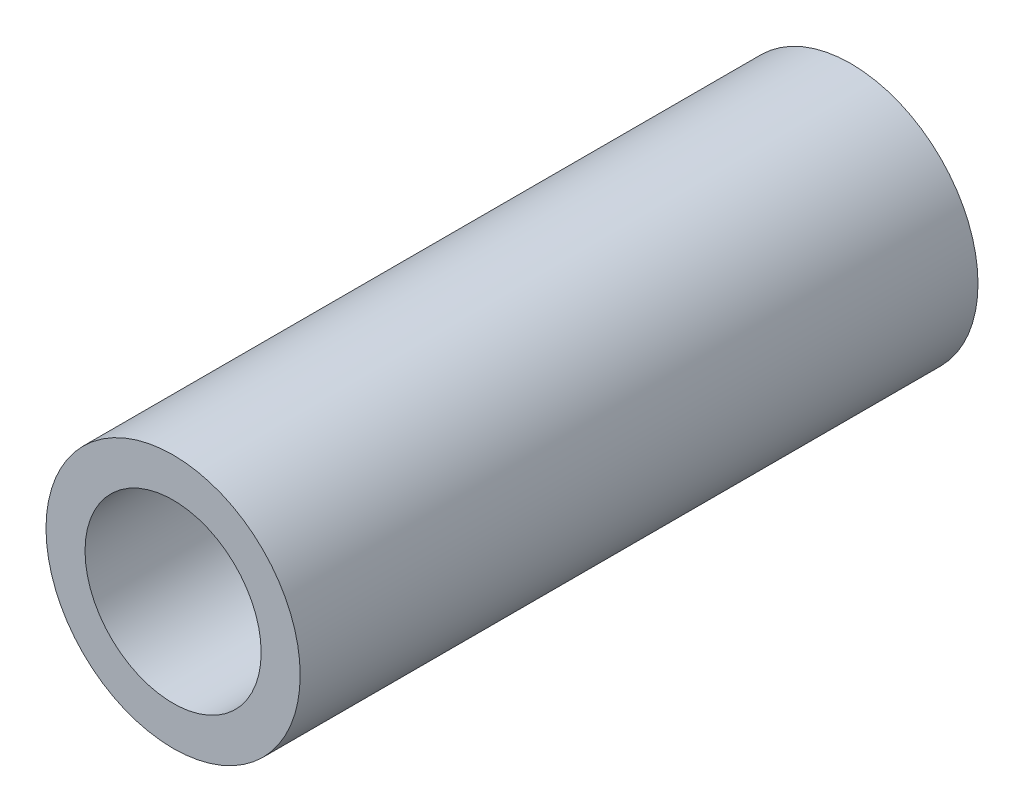
ISO-10303-21;
HEADER;
FILE_DESCRIPTION(('STEP AP214'),'2;1');
FILE_NAME('part.step','',(''),(''),'','','');
FILE_SCHEMA(('AUTOMOTIVE_DESIGN { 1 0 10303 214 1 1 1 1 }'));
ENDSEC;
DATA;
#1=APPLICATION_CONTEXT('core data for automotive mechanical design processes');
#2=APPLICATION_PROTOCOL_DEFINITION('international standard','automotive_design',2000,#1);
#3=PRODUCT_CONTEXT('',#1,'mechanical');
#4=PRODUCT('Part','Part','',(#3));
#5=PRODUCT_RELATED_PRODUCT_CATEGORY('part','',(#4));
#6=PRODUCT_DEFINITION_FORMATION('','',#4);
#7=PRODUCT_DEFINITION_CONTEXT('part definition',#1,'design');
#8=PRODUCT_DEFINITION('design','',#6,#7);
#9=PRODUCT_DEFINITION_SHAPE('','',#8);
#10=(LENGTH_UNIT() NAMED_UNIT(*) SI_UNIT(.MILLI.,.METRE.));
#11=(NAMED_UNIT(*) PLANE_ANGLE_UNIT() SI_UNIT($,.RADIAN.));
#12=(NAMED_UNIT(*) SI_UNIT($,.STERADIAN.) SOLID_ANGLE_UNIT());
#13=UNCERTAINTY_MEASURE_WITH_UNIT(LENGTH_MEASURE(1.E-05),#10,'distance_accuracy_value','');
#14=(GEOMETRIC_REPRESENTATION_CONTEXT(3) GLOBAL_UNCERTAINTY_ASSIGNED_CONTEXT((#13)) GLOBAL_UNIT_ASSIGNED_CONTEXT((#10,
#11,#12)) REPRESENTATION_CONTEXT('',''));
#15=CARTESIAN_POINT('',(0.,0.,0.));
#16=DIRECTION('',(0.,0.,1.));
#17=DIRECTION('',(1.,0.,0.));
#18=AXIS2_PLACEMENT_3D('',#15,#16,#17);
#19=CARTESIAN_POINT('',(0.,0.,-12.7));
#20=DIRECTION('',(0.,0.,1.));
#21=DIRECTION('',(1.,0.,0.));
#22=AXIS2_PLACEMENT_3D('',#19,#20,#21);
#23=CYLINDRICAL_SURFACE('',#22,2.38125);
#24=CARTESIAN_POINT('',(0.,0.,-12.7));
#25=DIRECTION('',(0.,0.,1.));
#26=DIRECTION('',(1.,0.,0.));
#27=AXIS2_PLACEMENT_3D('',#24,#25,#26);
#28=CIRCLE('',#27,2.38125);
#29=CARTESIAN_POINT('',(2.38125,0.,-12.7));
#30=VERTEX_POINT('',#29);
#31=EDGE_CURVE('E10',#30,#30,#28,.T.);
#32=ORIENTED_EDGE('',*,*,#31,.T.);
#33=EDGE_LOOP('',(#32));
#34=FACE_BOUND('',#33,.T.);
#35=CARTESIAN_POINT('',(0.,0.,0.));
#36=DIRECTION('',(0.,0.,1.));
#37=DIRECTION('',(1.,0.,0.));
#38=AXIS2_PLACEMENT_3D('',#35,#36,#37);
#39=CIRCLE('',#38,2.38125);
#40=CARTESIAN_POINT('',(2.38125,0.,0.));
#41=VERTEX_POINT('',#40);
#42=EDGE_CURVE('E40',#41,#41,#39,.T.);
#43=ORIENTED_EDGE('',*,*,#42,.F.);
#44=EDGE_LOOP('',(#43));
#45=FACE_BOUND('',#44,.T.);
#46=ADVANCED_FACE('F37',(#34,#45),#23,.T.);
#47=CARTESIAN_POINT('',(0.,0.,-12.7));
#48=DIRECTION('',(0.,0.,1.));
#49=DIRECTION('',(1.,0.,0.));
#50=AXIS2_PLACEMENT_3D('',#47,#48,#49);
#51=PLANE('',#50);
#52=CARTESIAN_POINT('',(0.,0.,-12.7));
#53=DIRECTION('',(0.,0.,1.));
#54=DIRECTION('',(1.,0.,0.));
#55=AXIS2_PLACEMENT_3D('',#52,#53,#54);
#56=CIRCLE('',#55,1.64999999999999);
#57=CARTESIAN_POINT('',(1.64999999999999,0.,-12.7));
#58=VERTEX_POINT('',#57);
#59=EDGE_CURVE('E47',#58,#58,#56,.T.);
#60=ORIENTED_EDGE('',*,*,#59,.T.);
#61=EDGE_LOOP('',(#60));
#62=FACE_BOUND('',#61,.T.);
#63=ORIENTED_EDGE('',*,*,#31,.F.);
#64=EDGE_LOOP('',(#63));
#65=FACE_BOUND('',#64,.T.);
#66=ADVANCED_FACE('F60',(#62,#65),#51,.F.);
#67=CARTESIAN_POINT('',(0.,0.,0.));
#68=DIRECTION('',(0.,0.,1.));
#69=DIRECTION('',(1.,0.,0.));
#70=AXIS2_PLACEMENT_3D('',#67,#68,#69);
#71=PLANE('',#70);
#72=CARTESIAN_POINT('',(0.,0.,0.));
#73=DIRECTION('',(0.,0.,1.));
#74=DIRECTION('',(1.,0.,0.));
#75=AXIS2_PLACEMENT_3D('',#72,#73,#74);
#76=CIRCLE('',#75,1.64999999999999);
#77=CARTESIAN_POINT('',(1.64999999999999,0.,0.));
#78=VERTEX_POINT('',#77);
#79=EDGE_CURVE('E51',#78,#78,#76,.T.);
#80=ORIENTED_EDGE('',*,*,#79,.F.);
#81=EDGE_LOOP('',(#80));
#82=FACE_BOUND('',#81,.T.);
#83=ORIENTED_EDGE('',*,*,#42,.T.);
#84=EDGE_LOOP('',(#83));
#85=FACE_BOUND('',#84,.T.);
#86=ADVANCED_FACE('F57',(#82,#85),#71,.T.);
#87=CARTESIAN_POINT('',(0.,0.,0.));
#88=DIRECTION('',(0.,0.,1.));
#89=DIRECTION('',(1.,0.,0.));
#90=AXIS2_PLACEMENT_3D('',#87,#88,#89);
#91=CYLINDRICAL_SURFACE('',#90,1.64999999999999);
#92=ORIENTED_EDGE('',*,*,#59,.F.);
#93=EDGE_LOOP('',(#92));
#94=FACE_BOUND('',#93,.T.);
#95=ORIENTED_EDGE('',*,*,#79,.T.);
#96=EDGE_LOOP('',(#95));
#97=FACE_BOUND('',#96,.T.);
#98=ADVANCED_FACE('F55',(#94,#97),#91,.F.);
#99=CLOSED_SHELL('',(#46,#66,#86,#98));
#100=MANIFOLD_SOLID_BREP('B2',#99);
#101=ADVANCED_BREP_SHAPE_REPRESENTATION('',(#18,#100),#14);
#102=SHAPE_DEFINITION_REPRESENTATION(#9,#101);
ENDSEC;
END-ISO-10303-21;
